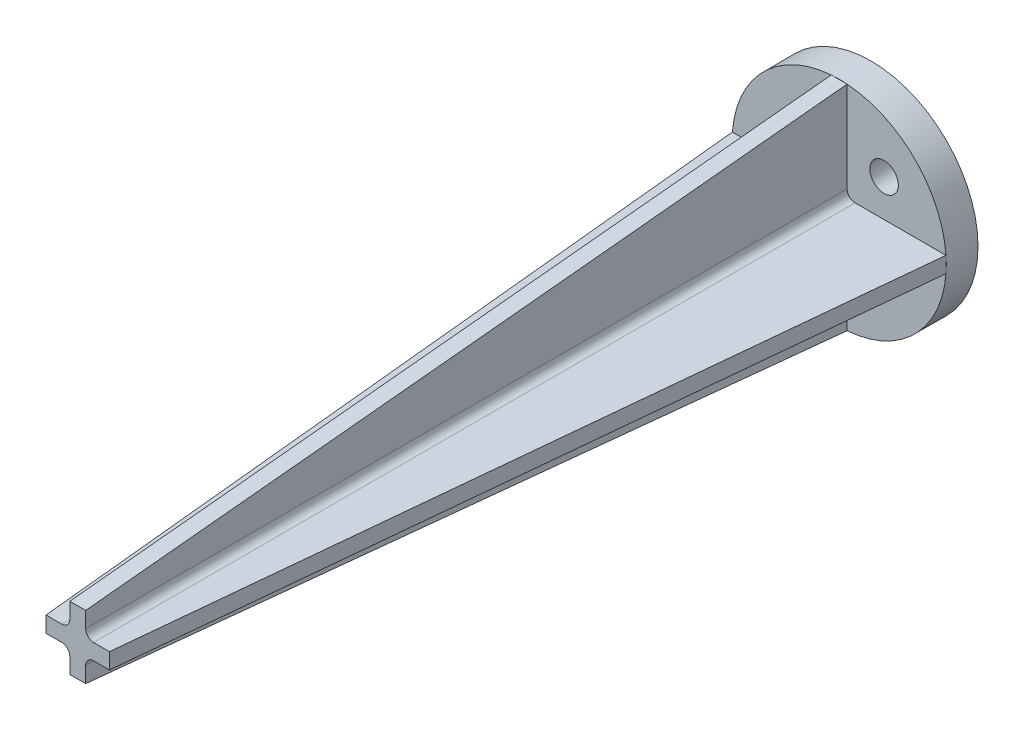
ISO-10303-21;
HEADER;
FILE_DESCRIPTION(('STEP AP214'),'2;1');
FILE_NAME('part.step','',(''),(''),'','','');
FILE_SCHEMA(('AUTOMOTIVE_DESIGN { 1 0 10303 214 1 1 1 1 }'));
ENDSEC;
DATA;
#1=APPLICATION_CONTEXT('core data for automotive mechanical design processes');
#2=APPLICATION_PROTOCOL_DEFINITION('international standard','automotive_design',2000,#1);
#3=PRODUCT_CONTEXT('',#1,'mechanical');
#4=PRODUCT('Part','Part','',(#3));
#5=PRODUCT_RELATED_PRODUCT_CATEGORY('part','',(#4));
#6=PRODUCT_DEFINITION_FORMATION('','',#4);
#7=PRODUCT_DEFINITION_CONTEXT('part definition',#1,'design');
#8=PRODUCT_DEFINITION('design','',#6,#7);
#9=PRODUCT_DEFINITION_SHAPE('','',#8);
#10=(LENGTH_UNIT() NAMED_UNIT(*) SI_UNIT(.MILLI.,.METRE.));
#11=(NAMED_UNIT(*) PLANE_ANGLE_UNIT() SI_UNIT($,.RADIAN.));
#12=(NAMED_UNIT(*) SI_UNIT($,.STERADIAN.) SOLID_ANGLE_UNIT());
#13=UNCERTAINTY_MEASURE_WITH_UNIT(LENGTH_MEASURE(1.E-05),#10,'distance_accuracy_value','');
#14=(GEOMETRIC_REPRESENTATION_CONTEXT(3) GLOBAL_UNCERTAINTY_ASSIGNED_CONTEXT((#13)) GLOBAL_UNIT_ASSIGNED_CONTEXT((#10,
#11,#12)) REPRESENTATION_CONTEXT('',''));
#15=CARTESIAN_POINT('',(0.,0.,0.));
#16=DIRECTION('',(0.,0.,1.));
#17=DIRECTION('',(1.,0.,0.));
#18=AXIS2_PLACEMENT_3D('',#15,#16,#17);
#19=CARTESIAN_POINT('',(-5.656851476545,5.656857022438,0.));
#20=DIRECTION('',(0.,0.,-1.));
#21=DIRECTION('',(1.,0.,0.));
#22=AXIS2_PLACEMENT_3D('',#19,#20,#21);
#23=CYLINDRICAL_SURFACE('',#22,1.8);
#24=DIRECTION('',(0.,0.,1.));
#25=VECTOR('',#24,1.);
#26=CARTESIAN_POINT('',(-3.856851476545,5.656857022438,0.));
#27=LINE('',#26,#25);
#28=CARTESIAN_POINT('',(-3.856851476545,5.656857022438,0.));
#29=VERTEX_POINT('',#28);
#30=CARTESIAN_POINT('',(-3.856851476545,5.656857022438,4.));
#31=VERTEX_POINT('',#30);
#32=EDGE_CURVE('E10',#29,#31,#27,.T.);
#33=ORIENTED_EDGE('',*,*,#32,.T.);
#34=CARTESIAN_POINT('',(-5.656851476545,5.656857022438,4.));
#35=DIRECTION('',(0.,0.,1.));
#36=DIRECTION('',(1.,0.,0.));
#37=AXIS2_PLACEMENT_3D('',#34,#35,#36);
#38=CIRCLE('',#37,1.8);
#39=EDGE_CURVE('E442',#31,#31,#38,.T.);
#40=ORIENTED_EDGE('',*,*,#39,.T.);
#41=ORIENTED_EDGE('',*,*,#32,.F.);
#42=CARTESIAN_POINT('',(-5.656851476545,5.656857022438,0.));
#43=DIRECTION('',(0.,0.,1.));
#44=DIRECTION('',(1.,0.,0.));
#45=AXIS2_PLACEMENT_3D('',#42,#43,#44);
#46=CIRCLE('',#45,1.8);
#47=EDGE_CURVE('E354',#29,#29,#46,.T.);
#48=ORIENTED_EDGE('',*,*,#47,.F.);
#49=EDGE_LOOP('',(#33,#40,#41,#48));
#50=FACE_BOUND('',#49,.T.);
#51=ADVANCED_FACE('F15',(#50),#23,.F.);
#52=CARTESIAN_POINT('',(-5.656851476545,-5.656857022438,0.));
#53=DIRECTION('',(0.,0.,-1.));
#54=DIRECTION('',(1.,0.,0.));
#55=AXIS2_PLACEMENT_3D('',#52,#53,#54);
#56=CYLINDRICAL_SURFACE('',#55,1.8);
#57=DIRECTION('',(0.,0.,1.));
#58=VECTOR('',#57,1.);
#59=CARTESIAN_POINT('',(-3.856851476545,-5.656857022438,0.));
#60=LINE('',#59,#58);
#61=CARTESIAN_POINT('',(-3.856851476545,-5.656857022438,0.));
#62=VERTEX_POINT('',#61);
#63=CARTESIAN_POINT('',(-3.856851476545,-5.656857022438,4.));
#64=VERTEX_POINT('',#63);
#65=EDGE_CURVE('E23',#62,#64,#60,.T.);
#66=ORIENTED_EDGE('',*,*,#65,.T.);
#67=CARTESIAN_POINT('',(-5.656851476545,-5.656857022438,4.));
#68=DIRECTION('',(0.,0.,1.));
#69=DIRECTION('',(1.,0.,0.));
#70=AXIS2_PLACEMENT_3D('',#67,#68,#69);
#71=CIRCLE('',#70,1.8);
#72=EDGE_CURVE('E287',#64,#64,#71,.T.);
#73=ORIENTED_EDGE('',*,*,#72,.T.);
#74=ORIENTED_EDGE('',*,*,#65,.F.);
#75=CARTESIAN_POINT('',(-5.656851476545,-5.656857022438,0.));
#76=DIRECTION('',(0.,0.,1.));
#77=DIRECTION('',(1.,0.,0.));
#78=AXIS2_PLACEMENT_3D('',#75,#76,#77);
#79=CIRCLE('',#78,1.8);
#80=EDGE_CURVE('E358',#62,#62,#79,.T.);
#81=ORIENTED_EDGE('',*,*,#80,.F.);
#82=EDGE_LOOP('',(#66,#73,#74,#81));
#83=FACE_BOUND('',#82,.T.);
#84=ADVANCED_FACE('F763',(#83),#56,.F.);
#85=CARTESIAN_POINT('',(5.656855173808,5.656853325177,0.));
#86=DIRECTION('',(0.,0.,-1.));
#87=DIRECTION('',(1.,0.,0.));
#88=AXIS2_PLACEMENT_3D('',#85,#86,#87);
#89=CYLINDRICAL_SURFACE('',#88,1.8);
#90=DIRECTION('',(0.,0.,1.));
#91=VECTOR('',#90,1.);
#92=CARTESIAN_POINT('',(7.456855173808,5.656853325177,0.));
#93=LINE('',#92,#91);
#94=CARTESIAN_POINT('',(7.456855173808,5.656853325177,0.));
#95=VERTEX_POINT('',#94);
#96=CARTESIAN_POINT('',(7.456855173808,5.656853325177,4.));
#97=VERTEX_POINT('',#96);
#98=EDGE_CURVE('E35',#95,#97,#93,.T.);
#99=ORIENTED_EDGE('',*,*,#98,.T.);
#100=CARTESIAN_POINT('',(5.656855173808,5.656853325177,4.));
#101=DIRECTION('',(0.,0.,1.));
#102=DIRECTION('',(1.,0.,0.));
#103=AXIS2_PLACEMENT_3D('',#100,#101,#102);
#104=CIRCLE('',#103,1.8);
#105=EDGE_CURVE('E461',#97,#97,#104,.T.);
#106=ORIENTED_EDGE('',*,*,#105,.T.);
#107=ORIENTED_EDGE('',*,*,#98,.F.);
#108=CARTESIAN_POINT('',(5.656855173808,5.656853325177,0.));
#109=DIRECTION('',(0.,0.,1.));
#110=DIRECTION('',(1.,0.,0.));
#111=AXIS2_PLACEMENT_3D('',#108,#109,#110);
#112=CIRCLE('',#111,1.8);
#113=EDGE_CURVE('E410',#95,#95,#112,.T.);
#114=ORIENTED_EDGE('',*,*,#113,.F.);
#115=EDGE_LOOP('',(#99,#106,#107,#114));
#116=FACE_BOUND('',#115,.T.);
#117=ADVANCED_FACE('F753',(#116),#89,.F.);
#118=CARTESIAN_POINT('',(-2.,-1.999999999999,4.));
#119=DIRECTION('',(0.,0.,1.));
#120=DIRECTION('',(7.2552E-13,1.,0.));
#121=AXIS2_PLACEMENT_3D('',#118,#119,#120);
#122=CYLINDRICAL_SURFACE('',#121,1.);
#123=CARTESIAN_POINT('',(-2.,-1.999999999999,4.));
#124=DIRECTION('',(0.,0.,-1.));
#125=DIRECTION('',(0.,-1.,0.));
#126=AXIS2_PLACEMENT_3D('',#123,#124,#125);
#127=CIRCLE('',#126,1.);
#128=CARTESIAN_POINT('',(-1.999999999999,-0.999999999999,4.));
#129=VERTEX_POINT('',#128);
#130=CARTESIAN_POINT('',(-1.,-1.999999999999,4.));
#131=VERTEX_POINT('',#130);
#132=EDGE_CURVE('E268',#129,#131,#127,.T.);
#133=ORIENTED_EDGE('',*,*,#132,.T.);
#134=DIRECTION('',(0.,0.,1.));
#135=VECTOR('',#134,1.);
#136=CARTESIAN_POINT('',(-1.,-1.999999999999,4.));
#137=LINE('',#136,#135);
#138=CARTESIAN_POINT('',(-1.,-1.999999999999,100.));
#139=VERTEX_POINT('',#138);
#140=EDGE_CURVE('E467',#131,#139,#137,.T.);
#141=ORIENTED_EDGE('',*,*,#140,.T.);
#142=CARTESIAN_POINT('',(-2.,-1.999999999999,100.));
#143=DIRECTION('',(0.,0.,-1.));
#144=DIRECTION('',(0.,-1.,0.));
#145=AXIS2_PLACEMENT_3D('',#142,#143,#144);
#146=CIRCLE('',#145,1.);
#147=CARTESIAN_POINT('',(-1.999999999999,-0.999999999999,100.));
#148=VERTEX_POINT('',#147);
#149=EDGE_CURVE('E391',#148,#139,#146,.T.);
#150=ORIENTED_EDGE('',*,*,#149,.F.);
#151=DIRECTION('',(0.,0.,1.));
#152=VECTOR('',#151,1.);
#153=CARTESIAN_POINT('',(-1.999999999999,-0.999999999999,4.));
#154=LINE('',#153,#152);
#155=EDGE_CURVE('E395',#129,#148,#154,.T.);
#156=ORIENTED_EDGE('',*,*,#155,.F.);
#157=EDGE_LOOP('',(#133,#141,#150,#156));
#158=FACE_BOUND('',#157,.T.);
#159=ADVANCED_FACE('F743',(#158),#122,.F.);
#160=CARTESIAN_POINT('',(-13.46291201783,-0.999999999991,4.));
#161=DIRECTION('',(7.2552E-13,1.,0.));
#162=DIRECTION('',(1.,-7.2552E-13,0.));
#163=AXIS2_PLACEMENT_3D('',#160,#161,#162);
#164=PLANE('',#163);
#165=ORIENTED_EDGE('',*,*,#155,.T.);
#166=DIRECTION('',(1.,-7.2552E-13,0.));
#167=VECTOR('',#166,1.);
#168=CARTESIAN_POINT('',(-13.46291201783,-0.999999999991,100.));
#169=LINE('',#168,#167);
#170=CARTESIAN_POINT('',(-4.,-1.,100.));
#171=VERTEX_POINT('',#170);
#172=EDGE_CURVE('E387',#171,#148,#169,.T.);
#173=ORIENTED_EDGE('',*,*,#172,.F.);
#174=DIRECTION('',(0.0980965775311955,0.,0.995176899589548));
#175=VECTOR('',#174,1.);
#176=CARTESIAN_POINT('',(-13.46291201783,-1.,4.));
#177=LINE('',#176,#175);
#178=CARTESIAN_POINT('',(-13.46291201783,-0.999999999991,4.));
#179=VERTEX_POINT('',#178);
#180=EDGE_CURVE('E392',#179,#171,#177,.T.);
#181=ORIENTED_EDGE('',*,*,#180,.F.);
#182=DIRECTION('',(1.,-7.2552E-13,0.));
#183=VECTOR('',#182,1.);
#184=CARTESIAN_POINT('',(-13.46291201783,-0.999999999991,4.));
#185=LINE('',#184,#183);
#186=EDGE_CURVE('E269',#179,#129,#185,.T.);
#187=ORIENTED_EDGE('',*,*,#186,.T.);
#188=EDGE_LOOP('',(#165,#173,#181,#187));
#189=FACE_BOUND('',#188,.T.);
#190=ADVANCED_FACE('F733',(#189),#164,.F.);
#191=CARTESIAN_POINT('',(-13.46291201783,-1.,4.));
#192=DIRECTION('',(0.995176899589548,0.,-0.0980965775311955));
#193=DIRECTION('',(0.,-1.,0.));
#194=AXIS2_PLACEMENT_3D('',#191,#192,#193);
#195=PLANE('',#194);
#196=DIRECTION('',(0.,1.,0.));
#197=VECTOR('',#196,1.);
#198=CARTESIAN_POINT('',(-4.,-1.,100.));
#199=LINE('',#198,#197);
#200=CARTESIAN_POINT('',(-4.,0.999999999998,100.));
#201=VERTEX_POINT('',#200);
#202=EDGE_CURVE('E383',#171,#201,#199,.T.);
#203=ORIENTED_EDGE('',*,*,#202,.T.);
#204=DIRECTION('',(-0.0980965775311955,0.,-0.995176899589548));
#205=VECTOR('',#204,1.);
#206=CARTESIAN_POINT('',(-13.46291201783,0.999999999991,4.));
#207=LINE('',#206,#205);
#208=CARTESIAN_POINT('',(-13.46291201783,0.999999999991,4.));
#209=VERTEX_POINT('',#208);
#210=EDGE_CURVE('E396',#201,#209,#207,.T.);
#211=ORIENTED_EDGE('',*,*,#210,.T.);
#212=DIRECTION('',(0.,1.,0.));
#213=VECTOR('',#212,1.);
#214=CARTESIAN_POINT('',(-13.46291201783,-1.,4.));
#215=LINE('',#214,#213);
#216=EDGE_CURVE('E282',#179,#209,#215,.T.);
#217=ORIENTED_EDGE('',*,*,#216,.F.);
#218=ORIENTED_EDGE('',*,*,#180,.T.);
#219=EDGE_LOOP('',(#203,#211,#217,#218));
#220=FACE_BOUND('',#219,.T.);
#221=ADVANCED_FACE('F723',(#220),#195,.F.);
#222=CARTESIAN_POINT('',(-13.46291201783,0.999999999991,4.));
#223=DIRECTION('',(-7.2579E-13,1.,0.));
#224=DIRECTION('',(1.,7.2579E-13,0.));
#225=AXIS2_PLACEMENT_3D('',#222,#223,#224);
#226=PLANE('',#225);
#227=DIRECTION('',(1.,7.2579E-13,0.));
#228=VECTOR('',#227,1.);
#229=CARTESIAN_POINT('',(-13.46291201783,0.999999999991,4.));
#230=LINE('',#229,#228);
#231=CARTESIAN_POINT('',(-1.999999999999,0.999999999999,4.));
#232=VERTEX_POINT('',#231);
#233=EDGE_CURVE('E434',#209,#232,#230,.T.);
#234=ORIENTED_EDGE('',*,*,#233,.F.);
#235=ORIENTED_EDGE('',*,*,#210,.F.);
#236=DIRECTION('',(1.,7.2579E-13,0.));
#237=VECTOR('',#236,1.);
#238=CARTESIAN_POINT('',(-13.46291201783,0.999999999991,100.));
#239=LINE('',#238,#237);
#240=CARTESIAN_POINT('',(-1.999999999999,0.999999999999,100.));
#241=VERTEX_POINT('',#240);
#242=EDGE_CURVE('E379',#201,#241,#239,.T.);
#243=ORIENTED_EDGE('',*,*,#242,.T.);
#244=DIRECTION('',(0.,0.,1.));
#245=VECTOR('',#244,1.);
#246=CARTESIAN_POINT('',(-1.999999999999,0.999999999999,4.));
#247=LINE('',#246,#245);
#248=EDGE_CURVE('E314',#232,#241,#247,.T.);
#249=ORIENTED_EDGE('',*,*,#248,.F.);
#250=EDGE_LOOP('',(#234,#235,#243,#249));
#251=FACE_BOUND('',#250,.T.);
#252=ADVANCED_FACE('F713',(#251),#226,.T.);
#253=CARTESIAN_POINT('',(-2.,1.999999999999,4.));
#254=DIRECTION('',(0.,0.,1.));
#255=DIRECTION('',(1.,0.,0.));
#256=AXIS2_PLACEMENT_3D('',#253,#254,#255);
#257=CYLINDRICAL_SURFACE('',#256,1.);
#258=CARTESIAN_POINT('',(-2.,1.999999999999,4.));
#259=DIRECTION('',(0.,0.,-1.));
#260=DIRECTION('',(0.,-1.,0.));
#261=AXIS2_PLACEMENT_3D('',#258,#259,#260);
#262=CIRCLE('',#261,1.);
#263=CARTESIAN_POINT('',(-1.,1.999999999999,4.));
#264=VERTEX_POINT('',#263);
#265=EDGE_CURVE('E438',#264,#232,#262,.T.);
#266=ORIENTED_EDGE('',*,*,#265,.T.);
#267=ORIENTED_EDGE('',*,*,#248,.T.);
#268=CARTESIAN_POINT('',(-2.,1.999999999999,100.));
#269=DIRECTION('',(0.,0.,-1.));
#270=DIRECTION('',(0.,-1.,0.));
#271=AXIS2_PLACEMENT_3D('',#268,#269,#270);
#272=CIRCLE('',#271,1.);
#273=CARTESIAN_POINT('',(-1.,1.999999999999,100.));
#274=VERTEX_POINT('',#273);
#275=EDGE_CURVE('E363',#274,#241,#272,.T.);
#276=ORIENTED_EDGE('',*,*,#275,.F.);
#277=DIRECTION('',(0.,0.,1.));
#278=VECTOR('',#277,1.);
#279=CARTESIAN_POINT('',(-1.,1.999999999999,4.));
#280=LINE('',#279,#278);
#281=EDGE_CURVE('E311',#264,#274,#280,.T.);
#282=ORIENTED_EDGE('',*,*,#281,.F.);
#283=EDGE_LOOP('',(#266,#267,#276,#282));
#284=FACE_BOUND('',#283,.T.);
#285=ADVANCED_FACE('F527',(#284),#257,.F.);
#286=CARTESIAN_POINT('',(-1.,13.462912017836,4.));
#287=DIRECTION('',(1.,0.,0.));
#288=DIRECTION('',(0.,-1.,0.));
#289=AXIS2_PLACEMENT_3D('',#286,#287,#288);
#290=PLANE('',#289);
#291=ORIENTED_EDGE('',*,*,#281,.T.);
#292=DIRECTION('',(0.,-1.,0.));
#293=VECTOR('',#292,1.);
#294=CARTESIAN_POINT('',(-1.,13.462912017836,100.));
#295=LINE('',#294,#293);
#296=CARTESIAN_POINT('',(-1.,4.,100.));
#297=VERTEX_POINT('',#296);
#298=EDGE_CURVE('E359',#297,#274,#295,.T.);
#299=ORIENTED_EDGE('',*,*,#298,.F.);
#300=DIRECTION('',(0.,0.0980965775311955,-0.995176899589548));
#301=VECTOR('',#300,1.);
#302=CARTESIAN_POINT('',(-1.,8.731456008918,52.));
#303=LINE('',#302,#301);
#304=CARTESIAN_POINT('',(-1.,13.462912017836,4.));
#305=VERTEX_POINT('',#304);
#306=EDGE_CURVE('E315',#297,#305,#303,.T.);
#307=ORIENTED_EDGE('',*,*,#306,.T.);
#308=DIRECTION('',(0.,-1.,0.));
#309=VECTOR('',#308,1.);
#310=CARTESIAN_POINT('',(-1.,13.462912017836,4.));
#311=LINE('',#310,#309);
#312=EDGE_CURVE('E286',#305,#264,#311,.T.);
#313=ORIENTED_EDGE('',*,*,#312,.T.);
#314=EDGE_LOOP('',(#291,#299,#307,#313));
#315=FACE_BOUND('',#314,.T.);
#316=ADVANCED_FACE('F521',(#315),#290,.F.);
#317=CARTESIAN_POINT('',(1.,1.,4.));
#318=DIRECTION('',(0.,1.,0.));
#319=DIRECTION('',(1.,0.,0.));
#320=AXIS2_PLACEMENT_3D('',#317,#318,#319);
#321=PLANE('',#320);
#322=DIRECTION('',(1.,0.,0.));
#323=VECTOR('',#322,1.);
#324=CARTESIAN_POINT('',(1.,1.,4.));
#325=LINE('',#324,#323);
#326=CARTESIAN_POINT('',(2.,1.,4.));
#327=VERTEX_POINT('',#326);
#328=CARTESIAN_POINT('',(13.462912017836,1.,4.));
#329=VERTEX_POINT('',#328);
#330=EDGE_CURVE('E450',#327,#329,#325,.T.);
#331=ORIENTED_EDGE('',*,*,#330,.F.);
#332=DIRECTION('',(0.,0.,1.));
#333=VECTOR('',#332,1.);
#334=CARTESIAN_POINT('',(2.,1.,4.));
#335=LINE('',#334,#333);
#336=CARTESIAN_POINT('',(2.,1.,100.));
#337=VERTEX_POINT('',#336);
#338=EDGE_CURVE('E423',#327,#337,#335,.T.);
#339=ORIENTED_EDGE('',*,*,#338,.T.);
#340=DIRECTION('',(1.,0.,0.));
#341=VECTOR('',#340,1.);
#342=CARTESIAN_POINT('',(1.,1.,100.));
#343=LINE('',#342,#341);
#344=CARTESIAN_POINT('',(4.,1.,100.));
#345=VERTEX_POINT('',#344);
#346=EDGE_CURVE('E348',#337,#345,#343,.T.);
#347=ORIENTED_EDGE('',*,*,#346,.T.);
#348=DIRECTION('',(0.0980965775311955,0.,-0.995176899589548));
#349=VECTOR('',#348,1.);
#350=CARTESIAN_POINT('',(13.402947099752,1.,4.608336220952));
#351=LINE('',#350,#349);
#352=EDGE_CURVE('E464',#345,#329,#351,.T.);
#353=ORIENTED_EDGE('',*,*,#352,.T.);
#354=EDGE_LOOP('',(#331,#339,#347,#353));
#355=FACE_BOUND('',#354,.T.);
#356=ADVANCED_FACE('F526',(#355),#321,.T.);
#357=CARTESIAN_POINT('',(1.,4.,100.));
#358=DIRECTION('',(0.,-0.995176899589548,-0.0980965775311955));
#359=DIRECTION('',(0.,0.0980965775311955,-0.995176899589548));
#360=AXIS2_PLACEMENT_3D('',#357,#358,#359);
#361=PLANE('',#360);
#362=DIRECTION('',(-1.,0.,0.));
#363=VECTOR('',#362,1.);
#364=CARTESIAN_POINT('',(1.,13.462912017836,4.));
#365=LINE('',#364,#363);
#366=CARTESIAN_POINT('',(1.,13.462912017836,4.));
#367=VERTEX_POINT('',#366);
#368=EDGE_CURVE('E446',#367,#305,#365,.T.);
#369=ORIENTED_EDGE('',*,*,#368,.T.);
#370=ORIENTED_EDGE('',*,*,#306,.F.);
#371=DIRECTION('',(-1.,0.,0.));
#372=VECTOR('',#371,1.);
#373=CARTESIAN_POINT('',(1.,4.,100.));
#374=LINE('',#373,#372);
#375=CARTESIAN_POINT('',(1.,4.,100.));
#376=VERTEX_POINT('',#375);
#377=EDGE_CURVE('E364',#376,#297,#374,.T.);
#378=ORIENTED_EDGE('',*,*,#377,.F.);
#379=DIRECTION('',(0.,0.0980965775311955,-0.995176899589548));
#380=VECTOR('',#379,1.);
#381=CARTESIAN_POINT('',(1.,4.,100.));
#382=LINE('',#381,#380);
#383=EDGE_CURVE('E470',#376,#367,#382,.T.);
#384=ORIENTED_EDGE('',*,*,#383,.T.);
#385=EDGE_LOOP('',(#369,#370,#378,#384));
#386=FACE_BOUND('',#385,.T.);
#387=ADVANCED_FACE('F687',(#386),#361,.F.);
#388=CARTESIAN_POINT('',(2.,2.,4.));
#389=DIRECTION('',(0.,0.,1.));
#390=DIRECTION('',(0.,-1.,0.));
#391=AXIS2_PLACEMENT_3D('',#388,#389,#390);
#392=CYLINDRICAL_SURFACE('',#391,1.);
#393=CARTESIAN_POINT('',(2.,2.,4.));
#394=DIRECTION('',(0.,0.,-1.));
#395=DIRECTION('',(0.,-1.,0.));
#396=AXIS2_PLACEMENT_3D('',#393,#394,#395);
#397=CIRCLE('',#396,1.);
#398=CARTESIAN_POINT('',(1.,2.,4.));
#399=VERTEX_POINT('',#398);
#400=EDGE_CURVE('E458',#327,#399,#397,.T.);
#401=ORIENTED_EDGE('',*,*,#400,.T.);
#402=DIRECTION('',(0.,0.,1.));
#403=VECTOR('',#402,1.);
#404=CARTESIAN_POINT('',(1.,2.,4.));
#405=LINE('',#404,#403);
#406=CARTESIAN_POINT('',(1.,2.,100.));
#407=VERTEX_POINT('',#406);
#408=EDGE_CURVE('E44',#399,#407,#405,.T.);
#409=ORIENTED_EDGE('',*,*,#408,.T.);
#410=CARTESIAN_POINT('',(2.,2.,100.));
#411=DIRECTION('',(0.,0.,-1.));
#412=DIRECTION('',(0.,-1.,0.));
#413=AXIS2_PLACEMENT_3D('',#410,#411,#412);
#414=CIRCLE('',#413,1.);
#415=EDGE_CURVE('E406',#337,#407,#414,.T.);
#416=ORIENTED_EDGE('',*,*,#415,.F.);
#417=ORIENTED_EDGE('',*,*,#338,.F.);
#418=EDGE_LOOP('',(#401,#409,#416,#417));
#419=FACE_BOUND('',#418,.T.);
#420=ADVANCED_FACE('F678',(#419),#392,.F.);
#421=CARTESIAN_POINT('',(1.,13.462912017836,4.));
#422=DIRECTION('',(1.,0.,0.));
#423=DIRECTION('',(0.,-1.,0.));
#424=AXIS2_PLACEMENT_3D('',#421,#422,#423);
#425=PLANE('',#424);
#426=DIRECTION('',(0.,-1.,0.));
#427=VECTOR('',#426,1.);
#428=CARTESIAN_POINT('',(1.,13.462912017836,4.));
#429=LINE('',#428,#427);
#430=EDGE_CURVE('E454',#367,#399,#429,.T.);
#431=ORIENTED_EDGE('',*,*,#430,.F.);
#432=ORIENTED_EDGE('',*,*,#383,.F.);
#433=DIRECTION('',(0.,-1.,0.));
#434=VECTOR('',#433,1.);
#435=CARTESIAN_POINT('',(1.,13.462912017836,100.));
#436=LINE('',#435,#434);
#437=EDGE_CURVE('E219',#376,#407,#436,.T.);
#438=ORIENTED_EDGE('',*,*,#437,.T.);
#439=ORIENTED_EDGE('',*,*,#408,.F.);
#440=EDGE_LOOP('',(#431,#432,#438,#439));
#441=FACE_BOUND('',#440,.T.);
#442=ADVANCED_FACE('F668',(#441),#425,.T.);
#443=CARTESIAN_POINT('',(-0.999999999999,-13.46291201783,4.));
#444=DIRECTION('',(-1.,0.,0.));
#445=DIRECTION('',(0.,1.,0.));
#446=AXIS2_PLACEMENT_3D('',#443,#444,#445);
#447=PLANE('',#446);
#448=DIRECTION('',(0.,1.,0.));
#449=VECTOR('',#448,1.);
#450=CARTESIAN_POINT('',(-0.999999999999,-13.46291201783,4.));
#451=LINE('',#450,#449);
#452=CARTESIAN_POINT('',(-0.999999999999,-13.46291201783,4.));
#453=VERTEX_POINT('',#452);
#454=EDGE_CURVE('E265',#453,#131,#451,.T.);
#455=ORIENTED_EDGE('',*,*,#454,.F.);
#456=DIRECTION('',(0.,-0.0980965775311955,-0.995176899589548));
#457=VECTOR('',#456,1.);
#458=CARTESIAN_POINT('',(-0.999999999999,-13.46291201783,4.));
#459=LINE('',#458,#457);
#460=CARTESIAN_POINT('',(-1.,-4.,100.));
#461=VERTEX_POINT('',#460);
#462=EDGE_CURVE('E215',#461,#453,#459,.T.);
#463=ORIENTED_EDGE('',*,*,#462,.F.);
#464=DIRECTION('',(0.,1.,0.));
#465=VECTOR('',#464,1.);
#466=CARTESIAN_POINT('',(-0.999999999999,-13.46291201783,100.));
#467=LINE('',#466,#465);
#468=EDGE_CURVE('E349',#461,#139,#467,.T.);
#469=ORIENTED_EDGE('',*,*,#468,.T.);
#470=ORIENTED_EDGE('',*,*,#140,.F.);
#471=EDGE_LOOP('',(#455,#463,#469,#470));
#472=FACE_BOUND('',#471,.T.);
#473=ADVANCED_FACE('F658',(#472),#447,.T.);
#474=CARTESIAN_POINT('',(13.462912017836,-1.,4.));
#475=DIRECTION('',(0.995176899589548,0.,0.0980965775311955));
#476=DIRECTION('',(0.,-1.,0.));
#477=AXIS2_PLACEMENT_3D('',#474,#475,#476);
#478=PLANE('',#477);
#479=DIRECTION('',(-0.0980965775311955,0.,0.995176899589548));
#480=VECTOR('',#479,1.);
#481=CARTESIAN_POINT('',(13.462912017836,-1.,4.));
#482=LINE('',#481,#480);
#483=CARTESIAN_POINT('',(13.462912017836,-1.,4.));
#484=VERTEX_POINT('',#483);
#485=CARTESIAN_POINT('',(4.,-1.,100.));
#486=VERTEX_POINT('',#485);
#487=EDGE_CURVE('E273',#484,#486,#482,.T.);
#488=ORIENTED_EDGE('',*,*,#487,.F.);
#489=DIRECTION('',(0.,1.,0.));
#490=VECTOR('',#489,1.);
#491=CARTESIAN_POINT('',(13.462912017836,-1.,4.));
#492=LINE('',#491,#490);
#493=EDGE_CURVE('E322',#484,#329,#492,.T.);
#494=ORIENTED_EDGE('',*,*,#493,.T.);
#495=ORIENTED_EDGE('',*,*,#352,.F.);
#496=DIRECTION('',(0.,1.,0.));
#497=VECTOR('',#496,1.);
#498=CARTESIAN_POINT('',(4.,-1.,100.));
#499=LINE('',#498,#497);
#500=EDGE_CURVE('E344',#486,#345,#499,.T.);
#501=ORIENTED_EDGE('',*,*,#500,.F.);
#502=EDGE_LOOP('',(#488,#494,#495,#501));
#503=FACE_BOUND('',#502,.T.);
#504=ADVANCED_FACE('F624',(#503),#478,.T.);
#505=CARTESIAN_POINT('',(6.4300222574E-07,0.,4.));
#506=DIRECTION('',(0.,0.,1.));
#507=DIRECTION('',(1.,0.,0.));
#508=AXIS2_PLACEMENT_3D('',#505,#506,#507);
#509=PLANE('',#508);
#510=ORIENTED_EDGE('',*,*,#105,.F.);
#511=EDGE_LOOP('',(#510));
#512=FACE_BOUND('',#511,.T.);
#513=ORIENTED_EDGE('',*,*,#330,.T.);
#514=CARTESIAN_POINT('',(0.,0.,4.));
#515=DIRECTION('',(0.,0.,1.));
#516=DIRECTION('',(1.,0.,0.));
#517=AXIS2_PLACEMENT_3D('',#514,#515,#516);
#518=CIRCLE('',#517,13.5);
#519=EDGE_CURVE('E334',#329,#367,#518,.T.);
#520=ORIENTED_EDGE('',*,*,#519,.T.);
#521=ORIENTED_EDGE('',*,*,#430,.T.);
#522=ORIENTED_EDGE('',*,*,#400,.F.);
#523=EDGE_LOOP('',(#513,#520,#521,#522));
#524=FACE_BOUND('',#523,.T.);
#525=ADVANCED_FACE('F619',(#512,#524),#509,.T.);
#526=CARTESIAN_POINT('',(1.,13.462912017836,4.));
#527=DIRECTION('',(0.,0.,-1.));
#528=DIRECTION('',(0.,-1.,0.));
#529=AXIS2_PLACEMENT_3D('',#526,#527,#528);
#530=PLANE('',#529);
#531=ORIENTED_EDGE('',*,*,#368,.F.);
#532=CARTESIAN_POINT('',(0.,0.,4.));
#533=DIRECTION('',(0.,0.,1.));
#534=DIRECTION('',(1.,0.,0.));
#535=AXIS2_PLACEMENT_3D('',#532,#533,#534);
#536=CIRCLE('',#535,13.5);
#537=EDGE_CURVE('E299',#367,#305,#536,.T.);
#538=ORIENTED_EDGE('',*,*,#537,.T.);
#539=EDGE_LOOP('',(#531,#538));
#540=FACE_BOUND('',#539,.T.);
#541=ADVANCED_FACE('F578',(#540),#530,.F.);
#542=CARTESIAN_POINT('',(6.4300222574E-07,0.,4.));
#543=DIRECTION('',(0.,0.,1.));
#544=DIRECTION('',(1.,0.,0.));
#545=AXIS2_PLACEMENT_3D('',#542,#543,#544);
#546=PLANE('',#545);
#547=ORIENTED_EDGE('',*,*,#39,.F.);
#548=EDGE_LOOP('',(#547));
#549=FACE_BOUND('',#548,.T.);
#550=ORIENTED_EDGE('',*,*,#312,.F.);
#551=CARTESIAN_POINT('',(0.,0.,4.));
#552=DIRECTION('',(0.,0.,1.));
#553=DIRECTION('',(1.,0.,0.));
#554=AXIS2_PLACEMENT_3D('',#551,#552,#553);
#555=CIRCLE('',#554,13.5);
#556=EDGE_CURVE('E295',#305,#209,#555,.T.);
#557=ORIENTED_EDGE('',*,*,#556,.T.);
#558=ORIENTED_EDGE('',*,*,#233,.T.);
#559=ORIENTED_EDGE('',*,*,#265,.F.);
#560=EDGE_LOOP('',(#550,#557,#558,#559));
#561=FACE_BOUND('',#560,.T.);
#562=ADVANCED_FACE('F572',(#549,#561),#546,.T.);
#563=CARTESIAN_POINT('',(-31.020915,-1.,4.));
#564=DIRECTION('',(0.,0.,-1.));
#565=DIRECTION('',(0.,-1.,0.));
#566=AXIS2_PLACEMENT_3D('',#563,#564,#565);
#567=PLANE('',#566);
#568=CARTESIAN_POINT('',(0.,0.,4.));
#569=DIRECTION('',(0.,0.,1.));
#570=DIRECTION('',(1.,0.,0.));
#571=AXIS2_PLACEMENT_3D('',#568,#569,#570);
#572=CIRCLE('',#571,13.5);
#573=EDGE_CURVE('E300',#209,#179,#572,.T.);
#574=ORIENTED_EDGE('',*,*,#573,.T.);
#575=ORIENTED_EDGE('',*,*,#216,.T.);
#576=EDGE_LOOP('',(#574,#575));
#577=FACE_BOUND('',#576,.T.);
#578=ADVANCED_FACE('F577',(#577),#567,.F.);
#579=CARTESIAN_POINT('',(6.4300222574E-07,0.,4.));
#580=DIRECTION('',(0.,0.,1.));
#581=DIRECTION('',(1.,0.,0.));
#582=AXIS2_PLACEMENT_3D('',#579,#580,#581);
#583=PLANE('',#582);
#584=ORIENTED_EDGE('',*,*,#72,.F.);
#585=EDGE_LOOP('',(#584));
#586=FACE_BOUND('',#585,.T.);
#587=ORIENTED_EDGE('',*,*,#186,.F.);
#588=CARTESIAN_POINT('',(0.,0.,4.));
#589=DIRECTION('',(0.,0.,1.));
#590=DIRECTION('',(1.,0.,0.));
#591=AXIS2_PLACEMENT_3D('',#588,#589,#590);
#592=CIRCLE('',#591,13.5);
#593=EDGE_CURVE('E228',#179,#453,#592,.T.);
#594=ORIENTED_EDGE('',*,*,#593,.T.);
#595=ORIENTED_EDGE('',*,*,#454,.T.);
#596=ORIENTED_EDGE('',*,*,#132,.F.);
#597=EDGE_LOOP('',(#587,#594,#595,#596));
#598=FACE_BOUND('',#597,.T.);
#599=ADVANCED_FACE('F613',(#586,#598),#583,.T.);
#600=CARTESIAN_POINT('',(1.,-28.809478,4.));
#601=DIRECTION('',(0.,0.,-1.));
#602=DIRECTION('',(0.,-1.,0.));
#603=AXIS2_PLACEMENT_3D('',#600,#601,#602);
#604=PLANE('',#603);
#605=CARTESIAN_POINT('',(0.,0.,4.));
#606=DIRECTION('',(0.,0.,1.));
#607=DIRECTION('',(1.,0.,0.));
#608=AXIS2_PLACEMENT_3D('',#605,#606,#607);
#609=CIRCLE('',#608,13.5);
#610=CARTESIAN_POINT('',(0.999999999999,-13.46291201783,4.));
#611=VERTEX_POINT('',#610);
#612=EDGE_CURVE('E222',#453,#611,#609,.T.);
#613=ORIENTED_EDGE('',*,*,#612,.T.);
#614=DIRECTION('',(-1.,0.,0.));
#615=VECTOR('',#614,1.);
#616=CARTESIAN_POINT('',(1.,-13.46291201783,4.));
#617=LINE('',#616,#615);
#618=EDGE_CURVE('E207',#611,#453,#617,.T.);
#619=ORIENTED_EDGE('',*,*,#618,.T.);
#620=EDGE_LOOP('',(#613,#619));
#621=FACE_BOUND('',#620,.T.);
#622=ADVANCED_FACE('F223',(#621),#604,.F.);
#623=CARTESIAN_POINT('',(24.388362,-1.,4.));
#624=DIRECTION('',(0.,0.,1.));
#625=DIRECTION('',(0.,-1.,0.));
#626=AXIS2_PLACEMENT_3D('',#623,#624,#625);
#627=PLANE('',#626);
#628=ORIENTED_EDGE('',*,*,#493,.F.);
#629=CARTESIAN_POINT('',(0.,0.,4.));
#630=DIRECTION('',(0.,0.,1.));
#631=DIRECTION('',(1.,0.,0.));
#632=AXIS2_PLACEMENT_3D('',#629,#630,#631);
#633=CIRCLE('',#632,13.5);
#634=CARTESIAN_POINT('',(13.5,0.,4.));
#635=VERTEX_POINT('',#634);
#636=EDGE_CURVE('E229',#484,#635,#633,.T.);
#637=ORIENTED_EDGE('',*,*,#636,.T.);
#638=CARTESIAN_POINT('',(0.,0.,4.));
#639=DIRECTION('',(0.,0.,1.));
#640=DIRECTION('',(1.,0.,0.));
#641=AXIS2_PLACEMENT_3D('',#638,#639,#640);
#642=CIRCLE('',#641,13.5);
#643=EDGE_CURVE('E338',#635,#329,#642,.T.);
#644=ORIENTED_EDGE('',*,*,#643,.T.);
#645=EDGE_LOOP('',(#628,#637,#644));
#646=FACE_BOUND('',#645,.T.);
#647=ADVANCED_FACE('F493',(#646),#627,.T.);
#648=CARTESIAN_POINT('',(6.4300222574E-07,0.,0.));
#649=DIRECTION('',(0.,0.,1.));
#650=DIRECTION('',(1.,0.,0.));
#651=AXIS2_PLACEMENT_3D('',#648,#649,#650);
#652=PLANE('',#651);
#653=ORIENTED_EDGE('',*,*,#47,.T.);
#654=EDGE_LOOP('',(#653));
#655=FACE_BOUND('',#654,.T.);
#656=CARTESIAN_POINT('',(5.656855173808,-5.656853325177,0.));
#657=DIRECTION('',(0.,0.,1.));
#658=DIRECTION('',(1.,0.,0.));
#659=AXIS2_PLACEMENT_3D('',#656,#657,#658);
#660=CIRCLE('',#659,1.8);
#661=CARTESIAN_POINT('',(7.456855173808,-5.656853325177,0.));
#662=VERTEX_POINT('',#661);
#663=EDGE_CURVE('E328',#662,#662,#660,.T.);
#664=ORIENTED_EDGE('',*,*,#663,.T.);
#665=EDGE_LOOP('',(#664));
#666=FACE_BOUND('',#665,.T.);
#667=ORIENTED_EDGE('',*,*,#80,.T.);
#668=EDGE_LOOP('',(#667));
#669=FACE_BOUND('',#668,.T.);
#670=ORIENTED_EDGE('',*,*,#113,.T.);
#671=EDGE_LOOP('',(#670));
#672=FACE_BOUND('',#671,.T.);
#673=CARTESIAN_POINT('',(0.,0.,0.));
#674=DIRECTION('',(0.,0.,1.));
#675=DIRECTION('',(1.,0.,0.));
#676=AXIS2_PLACEMENT_3D('',#673,#674,#675);
#677=CIRCLE('',#676,13.5);
#678=CARTESIAN_POINT('',(13.5,0.,0.));
#679=VERTEX_POINT('',#678);
#680=EDGE_CURVE('E278',#679,#679,#677,.T.);
#681=ORIENTED_EDGE('',*,*,#680,.F.);
#682=EDGE_LOOP('',(#681));
#683=FACE_BOUND('',#682,.T.);
#684=ADVANCED_FACE('F487',(#655,#666,#669,#672,#683),#652,.F.);
#685=CARTESIAN_POINT('',(-1.90103442E-09,-3.97755268E-09,100.));
#686=DIRECTION('',(0.,0.,1.));
#687=DIRECTION('',(1.,0.,0.));
#688=AXIS2_PLACEMENT_3D('',#685,#686,#687);
#689=PLANE('',#688);
#690=ORIENTED_EDGE('',*,*,#437,.F.);
#691=ORIENTED_EDGE('',*,*,#377,.T.);
#692=ORIENTED_EDGE('',*,*,#298,.T.);
#693=ORIENTED_EDGE('',*,*,#275,.T.);
#694=ORIENTED_EDGE('',*,*,#242,.F.);
#695=ORIENTED_EDGE('',*,*,#202,.F.);
#696=ORIENTED_EDGE('',*,*,#172,.T.);
#697=ORIENTED_EDGE('',*,*,#149,.T.);
#698=ORIENTED_EDGE('',*,*,#468,.F.);
#699=DIRECTION('',(-1.,0.,0.));
#700=VECTOR('',#699,1.);
#701=CARTESIAN_POINT('',(1.,-4.,100.));
#702=LINE('',#701,#700);
#703=CARTESIAN_POINT('',(1.,-4.,100.));
#704=VERTEX_POINT('',#703);
#705=EDGE_CURVE('E325',#704,#461,#702,.T.);
#706=ORIENTED_EDGE('',*,*,#705,.F.);
#707=DIRECTION('',(0.,1.,0.));
#708=VECTOR('',#707,1.);
#709=CARTESIAN_POINT('',(0.999999999999,-13.46291201783,100.));
#710=LINE('',#709,#708);
#711=CARTESIAN_POINT('',(1.,-2.,100.));
#712=VERTEX_POINT('',#711);
#713=EDGE_CURVE('E238',#704,#712,#710,.T.);
#714=ORIENTED_EDGE('',*,*,#713,.T.);
#715=CARTESIAN_POINT('',(2.,-2.,100.));
#716=DIRECTION('',(0.,0.,-1.));
#717=DIRECTION('',(0.,-1.,0.));
#718=AXIS2_PLACEMENT_3D('',#715,#716,#717);
#719=CIRCLE('',#718,1.);
#720=CARTESIAN_POINT('',(2.,-1.,100.));
#721=VERTEX_POINT('',#720);
#722=EDGE_CURVE('E304',#712,#721,#719,.T.);
#723=ORIENTED_EDGE('',*,*,#722,.T.);
#724=DIRECTION('',(1.,0.,0.));
#725=VECTOR('',#724,1.);
#726=CARTESIAN_POINT('',(1.,-1.,100.));
#727=LINE('',#726,#725);
#728=EDGE_CURVE('E277',#721,#486,#727,.T.);
#729=ORIENTED_EDGE('',*,*,#728,.T.);
#730=ORIENTED_EDGE('',*,*,#500,.T.);
#731=ORIENTED_EDGE('',*,*,#346,.F.);
#732=ORIENTED_EDGE('',*,*,#415,.T.);
#733=EDGE_LOOP('',(#690,#691,#692,#693,#694,#695,#696,#697,#698,#706,#714,#723,#729,#730,#731,#732));
#734=FACE_BOUND('',#733,.T.);
#735=ADVANCED_FACE('F492',(#734),#689,.T.);
#736=CARTESIAN_POINT('',(1.,-13.46291201783,4.));
#737=DIRECTION('',(0.,0.995176899589548,-0.0980965775311955));
#738=DIRECTION('',(-1.,0.,0.));
#739=AXIS2_PLACEMENT_3D('',#736,#737,#738);
#740=PLANE('',#739);
#741=ORIENTED_EDGE('',*,*,#705,.T.);
#742=ORIENTED_EDGE('',*,*,#462,.T.);
#743=ORIENTED_EDGE('',*,*,#618,.F.);
#744=DIRECTION('',(0.,0.0980965775311955,0.995176899589548));
#745=VECTOR('',#744,1.);
#746=CARTESIAN_POINT('',(1.,-13.46291201783,4.));
#747=LINE('',#746,#745);
#748=EDGE_CURVE('E212',#611,#704,#747,.T.);
#749=ORIENTED_EDGE('',*,*,#748,.T.);
#750=EDGE_LOOP('',(#741,#742,#743,#749));
#751=FACE_BOUND('',#750,.T.);
#752=ADVANCED_FACE('F210',(#751),#740,.F.);
#753=CARTESIAN_POINT('',(5.656855173808,-5.656853325177,0.));
#754=DIRECTION('',(0.,0.,-1.));
#755=DIRECTION('',(1.,0.,0.));
#756=AXIS2_PLACEMENT_3D('',#753,#754,#755);
#757=CYLINDRICAL_SURFACE('',#756,1.8);
#758=DIRECTION('',(0.,0.,1.));
#759=VECTOR('',#758,1.);
#760=CARTESIAN_POINT('',(7.456855173808,-5.656853325177,0.));
#761=LINE('',#760,#759);
#762=CARTESIAN_POINT('',(7.456855173808,-5.656853325177,4.));
#763=VERTEX_POINT('',#762);
#764=EDGE_CURVE('E353',#662,#763,#761,.T.);
#765=ORIENTED_EDGE('',*,*,#764,.T.);
#766=CARTESIAN_POINT('',(5.656855173808,-5.656853325177,4.));
#767=DIRECTION('',(0.,0.,1.));
#768=DIRECTION('',(1.,0.,0.));
#769=AXIS2_PLACEMENT_3D('',#766,#767,#768);
#770=CIRCLE('',#769,1.8);
#771=EDGE_CURVE('E281',#763,#763,#770,.T.);
#772=ORIENTED_EDGE('',*,*,#771,.T.);
#773=ORIENTED_EDGE('',*,*,#764,.F.);
#774=ORIENTED_EDGE('',*,*,#663,.F.);
#775=EDGE_LOOP('',(#765,#772,#773,#774));
#776=FACE_BOUND('',#775,.T.);
#777=ADVANCED_FACE('F556',(#776),#757,.F.);
#778=CARTESIAN_POINT('',(1.,-1.,4.));
#779=DIRECTION('',(0.,1.,0.));
#780=DIRECTION('',(1.,0.,0.));
#781=AXIS2_PLACEMENT_3D('',#778,#779,#780);
#782=PLANE('',#781);
#783=ORIENTED_EDGE('',*,*,#487,.T.);
#784=ORIENTED_EDGE('',*,*,#728,.F.);
#785=DIRECTION('',(0.,0.,1.));
#786=VECTOR('',#785,1.);
#787=CARTESIAN_POINT('',(2.,-1.,4.));
#788=LINE('',#787,#786);
#789=CARTESIAN_POINT('',(2.,-1.,4.));
#790=VERTEX_POINT('',#789);
#791=EDGE_CURVE('E240',#790,#721,#788,.T.);
#792=ORIENTED_EDGE('',*,*,#791,.F.);
#793=DIRECTION('',(1.,0.,0.));
#794=VECTOR('',#793,1.);
#795=CARTESIAN_POINT('',(1.,-1.,4.));
#796=LINE('',#795,#794);
#797=EDGE_CURVE('E252',#790,#484,#796,.T.);
#798=ORIENTED_EDGE('',*,*,#797,.T.);
#799=EDGE_LOOP('',(#783,#784,#792,#798));
#800=FACE_BOUND('',#799,.T.);
#801=ADVANCED_FACE('F547',(#800),#782,.F.);
#802=CARTESIAN_POINT('',(0.,0.,0.));
#803=DIRECTION('',(0.,0.,-1.));
#804=DIRECTION('',(1.,0.,0.));
#805=AXIS2_PLACEMENT_3D('',#802,#803,#804);
#806=CYLINDRICAL_SURFACE('',#805,13.5);
#807=DIRECTION('',(0.,0.,1.));
#808=VECTOR('',#807,1.);
#809=CARTESIAN_POINT('',(13.5,0.,0.));
#810=LINE('',#809,#808);
#811=EDGE_CURVE('E308',#679,#635,#810,.T.);
#812=ORIENTED_EDGE('',*,*,#811,.T.);
#813=ORIENTED_EDGE('',*,*,#636,.F.);
#814=CARTESIAN_POINT('',(0.,0.,4.));
#815=DIRECTION('',(0.,0.,1.));
#816=DIRECTION('',(1.,0.,0.));
#817=AXIS2_PLACEMENT_3D('',#814,#815,#816);
#818=CIRCLE('',#817,13.5);
#819=EDGE_CURVE('E244',#611,#484,#818,.T.);
#820=ORIENTED_EDGE('',*,*,#819,.F.);
#821=ORIENTED_EDGE('',*,*,#612,.F.);
#822=ORIENTED_EDGE('',*,*,#593,.F.);
#823=ORIENTED_EDGE('',*,*,#573,.F.);
#824=ORIENTED_EDGE('',*,*,#556,.F.);
#825=ORIENTED_EDGE('',*,*,#537,.F.);
#826=ORIENTED_EDGE('',*,*,#519,.F.);
#827=ORIENTED_EDGE('',*,*,#643,.F.);
#828=ORIENTED_EDGE('',*,*,#811,.F.);
#829=ORIENTED_EDGE('',*,*,#680,.T.);
#830=EDGE_LOOP('',(#812,#813,#820,#821,#822,#823,#824,#825,#826,#827,#828,#829));
#831=FACE_BOUND('',#830,.T.);
#832=ADVANCED_FACE('F246',(#831),#806,.T.);
#833=CARTESIAN_POINT('',(2.,-2.,4.));
#834=DIRECTION('',(0.,0.,1.));
#835=DIRECTION('',(-1.,0.,0.));
#836=AXIS2_PLACEMENT_3D('',#833,#834,#835);
#837=CYLINDRICAL_SURFACE('',#836,1.);
#838=CARTESIAN_POINT('',(2.,-2.,4.));
#839=DIRECTION('',(0.,0.,-1.));
#840=DIRECTION('',(0.,-1.,0.));
#841=AXIS2_PLACEMENT_3D('',#838,#839,#840);
#842=CIRCLE('',#841,1.);
#843=CARTESIAN_POINT('',(1.,-2.,4.));
#844=VERTEX_POINT('',#843);
#845=EDGE_CURVE('E257',#844,#790,#842,.T.);
#846=ORIENTED_EDGE('',*,*,#845,.T.);
#847=ORIENTED_EDGE('',*,*,#791,.T.);
#848=ORIENTED_EDGE('',*,*,#722,.F.);
#849=DIRECTION('',(0.,0.,1.));
#850=VECTOR('',#849,1.);
#851=CARTESIAN_POINT('',(1.,-2.,4.));
#852=LINE('',#851,#850);
#853=EDGE_CURVE('E264',#844,#712,#852,.T.);
#854=ORIENTED_EDGE('',*,*,#853,.F.);
#855=EDGE_LOOP('',(#846,#847,#848,#854));
#856=FACE_BOUND('',#855,.T.);
#857=ADVANCED_FACE('F515',(#856),#837,.F.);
#858=CARTESIAN_POINT('',(0.999999999999,-13.46291201783,4.));
#859=DIRECTION('',(-1.,0.,0.));
#860=DIRECTION('',(0.,0.,1.));
#861=AXIS2_PLACEMENT_3D('',#858,#859,#860);
#862=PLANE('',#861);
#863=ORIENTED_EDGE('',*,*,#853,.T.);
#864=ORIENTED_EDGE('',*,*,#713,.F.);
#865=ORIENTED_EDGE('',*,*,#748,.F.);
#866=DIRECTION('',(0.,1.,0.));
#867=VECTOR('',#866,1.);
#868=CARTESIAN_POINT('',(0.999999999999,-13.46291201783,4.));
#869=LINE('',#868,#867);
#870=EDGE_CURVE('E236',#611,#844,#869,.T.);
#871=ORIENTED_EDGE('',*,*,#870,.T.);
#872=EDGE_LOOP('',(#863,#864,#865,#871));
#873=FACE_BOUND('',#872,.T.);
#874=ADVANCED_FACE('F234',(#873),#862,.F.);
#875=CARTESIAN_POINT('',(6.4300222574E-07,0.,4.));
#876=DIRECTION('',(0.,0.,1.));
#877=DIRECTION('',(1.,0.,0.));
#878=AXIS2_PLACEMENT_3D('',#875,#876,#877);
#879=PLANE('',#878);
#880=ORIENTED_EDGE('',*,*,#771,.F.);
#881=EDGE_LOOP('',(#880));
#882=FACE_BOUND('',#881,.T.);
#883=ORIENTED_EDGE('',*,*,#870,.F.);
#884=ORIENTED_EDGE('',*,*,#819,.T.);
#885=ORIENTED_EDGE('',*,*,#797,.F.);
#886=ORIENTED_EDGE('',*,*,#845,.F.);
#887=EDGE_LOOP('',(#883,#884,#885,#886));
#888=FACE_BOUND('',#887,.T.);
#889=ADVANCED_FACE('F255',(#882,#888),#879,.T.);
#890=CLOSED_SHELL('',(#51,#84,#117,#159,#190,#221,#252,#285,#316,#356,#387,#420,#442,#473,#504,
#525,#541,#562,#578,#599,#622,#647,#684,#735,#752,#777,#801,#832,#857,#874,#889));
#891=MANIFOLD_SOLID_BREP('B1',#890);
#892=ADVANCED_BREP_SHAPE_REPRESENTATION('',(#18,#891),#14);
#893=SHAPE_DEFINITION_REPRESENTATION(#9,#892);
ENDSEC;
END-ISO-10303-21;
